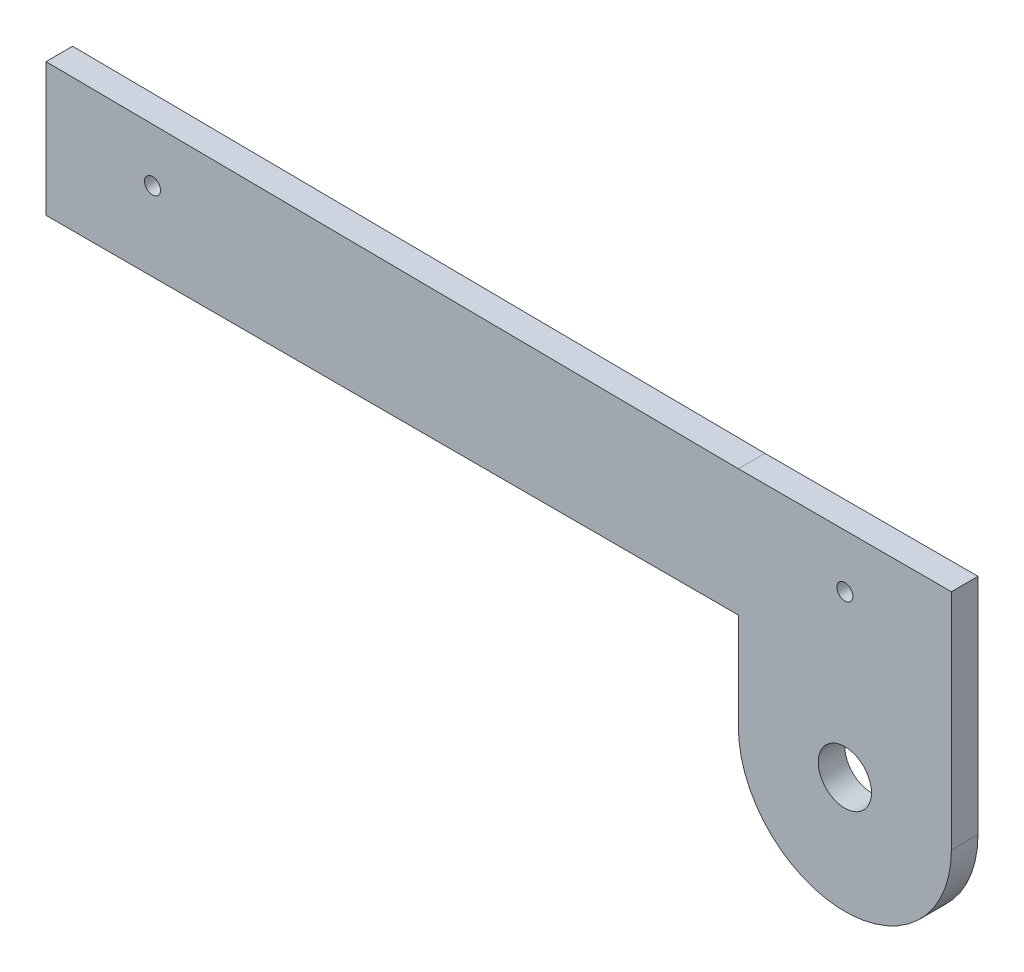
ISO-10303-21;
HEADER;
FILE_DESCRIPTION(('STEP AP214'),'2;1');
FILE_NAME('part.step','',(''),(''),'','','');
FILE_SCHEMA(('AUTOMOTIVE_DESIGN { 1 0 10303 214 1 1 1 1 }'));
ENDSEC;
DATA;
#1=APPLICATION_CONTEXT('core data for automotive mechanical design processes');
#2=APPLICATION_PROTOCOL_DEFINITION('international standard','automotive_design',2000,#1);
#3=PRODUCT_CONTEXT('',#1,'mechanical');
#4=PRODUCT('Part','Part','',(#3));
#5=PRODUCT_RELATED_PRODUCT_CATEGORY('part','',(#4));
#6=PRODUCT_DEFINITION_FORMATION('','',#4);
#7=PRODUCT_DEFINITION_CONTEXT('part definition',#1,'design');
#8=PRODUCT_DEFINITION('design','',#6,#7);
#9=PRODUCT_DEFINITION_SHAPE('','',#8);
#10=(LENGTH_UNIT() NAMED_UNIT(*) SI_UNIT(.MILLI.,.METRE.));
#11=(NAMED_UNIT(*) PLANE_ANGLE_UNIT() SI_UNIT($,.RADIAN.));
#12=(NAMED_UNIT(*) SI_UNIT($,.STERADIAN.) SOLID_ANGLE_UNIT());
#13=UNCERTAINTY_MEASURE_WITH_UNIT(LENGTH_MEASURE(1.E-05),#10,'distance_accuracy_value','');
#14=(GEOMETRIC_REPRESENTATION_CONTEXT(3) GLOBAL_UNCERTAINTY_ASSIGNED_CONTEXT((#13)) GLOBAL_UNIT_ASSIGNED_CONTEXT((#10,
#11,#12)) REPRESENTATION_CONTEXT('',''));
#15=CARTESIAN_POINT('',(0.,0.,0.));
#16=DIRECTION('',(0.,0.,1.));
#17=DIRECTION('',(1.,0.,0.));
#18=AXIS2_PLACEMENT_3D('',#15,#16,#17);
#19=CARTESIAN_POINT('',(0.,-76.7077662842641,5.));
#20=DIRECTION('',(0.,0.,1.));
#21=DIRECTION('',(1.,0.,0.));
#22=AXIS2_PLACEMENT_3D('',#19,#20,#21);
#23=PLANE('',#22);
#24=CARTESIAN_POINT('',(0.,-74.9078805598017,5.));
#25=DIRECTION('',(0.,0.,1.));
#26=DIRECTION('',(1.,0.,0.));
#27=AXIS2_PLACEMENT_3D('',#24,#25,#26);
#28=CIRCLE('',#27,5.);
#29=CARTESIAN_POINT('',(5.,-74.9078805598017,5.));
#30=VERTEX_POINT('',#29);
#31=EDGE_CURVE('E206',#30,#30,#28,.F.);
#32=ORIENTED_EDGE('',*,*,#31,.T.);
#33=EDGE_LOOP('',(#32));
#34=FACE_BOUND('',#33,.T.);
#35=CARTESIAN_POINT('',(0.,-44.7077662842641,5.));
#36=DIRECTION('',(0.,0.,1.));
#37=DIRECTION('',(1.,0.,0.));
#38=AXIS2_PLACEMENT_3D('',#35,#36,#37);
#39=CIRCLE('',#38,1.5);
#40=CARTESIAN_POINT('',(1.50000000000001,-44.7077662842641,5.));
#41=VERTEX_POINT('',#40);
#42=EDGE_CURVE('E145',#41,#41,#39,.T.);
#43=ORIENTED_EDGE('',*,*,#42,.F.);
#44=EDGE_LOOP('',(#43));
#45=FACE_BOUND('',#44,.T.);
#46=CARTESIAN_POINT('',(0.,-76.7077662842641,5.));
#47=DIRECTION('',(0.,0.,1.));
#48=DIRECTION('',(1.,0.,0.));
#49=AXIS2_PLACEMENT_3D('',#46,#47,#48);
#50=CIRCLE('',#49,20.);
#51=CARTESIAN_POINT('',(-20.,-76.7077662842641,5.));
#52=VERTEX_POINT('',#51);
#53=CARTESIAN_POINT('',(20.,-76.7077662842641,5.));
#54=VERTEX_POINT('',#53);
#55=EDGE_CURVE('E160',#52,#54,#50,.T.);
#56=ORIENTED_EDGE('',*,*,#55,.T.);
#57=DIRECTION('',(0.,1.,0.));
#58=VECTOR('',#57,1.);
#59=CARTESIAN_POINT('',(20.,-34.7077662842641,5.));
#60=LINE('',#59,#58);
#61=CARTESIAN_POINT('',(20.,-34.7077662842641,5.));
#62=VERTEX_POINT('',#61);
#63=EDGE_CURVE('E102',#54,#62,#60,.T.);
#64=ORIENTED_EDGE('',*,*,#63,.T.);
#65=DIRECTION('',(-1.,0.,0.));
#66=VECTOR('',#65,1.);
#67=CARTESIAN_POINT('',(-20.,-34.7077662842641,5.));
#68=LINE('',#67,#66);
#69=CARTESIAN_POINT('',(-20.,-34.7077662842641,5.));
#70=VERTEX_POINT('',#69);
#71=EDGE_CURVE('E178',#62,#70,#68,.T.);
#72=ORIENTED_EDGE('',*,*,#71,.T.);
#73=DIRECTION('',(-0.999957141967498,0.00925819789123466,0.));
#74=VECTOR('',#73,1.);
#75=CARTESIAN_POINT('',(-20.,-34.7077662842641,5.));
#76=LINE('',#75,#74);
#77=CARTESIAN_POINT('',(-150.,-33.5041489737338,5.));
#78=VERTEX_POINT('',#77);
#79=EDGE_CURVE('E118',#70,#78,#76,.T.);
#80=ORIENTED_EDGE('',*,*,#79,.T.);
#81=DIRECTION('',(0.,-1.,0.));
#82=VECTOR('',#81,1.);
#83=CARTESIAN_POINT('',(-150.,-33.5041489737338,5.));
#84=LINE('',#83,#82);
#85=CARTESIAN_POINT('',(-150.,-58.5041489737338,5.));
#86=VERTEX_POINT('',#85);
#87=EDGE_CURVE('E112',#78,#86,#84,.T.);
#88=ORIENTED_EDGE('',*,*,#87,.T.);
#89=DIRECTION('',(1.,0.,0.));
#90=VECTOR('',#89,1.);
#91=CARTESIAN_POINT('',(-150.,-58.5041489737338,5.));
#92=LINE('',#91,#90);
#93=CARTESIAN_POINT('',(-20.,-58.5041489737338,5.));
#94=VERTEX_POINT('',#93);
#95=EDGE_CURVE('E116',#86,#94,#92,.T.);
#96=ORIENTED_EDGE('',*,*,#95,.T.);
#97=DIRECTION('',(0.,-1.,0.));
#98=VECTOR('',#97,1.);
#99=CARTESIAN_POINT('',(-20.,-76.7077662842641,5.));
#100=LINE('',#99,#98);
#101=EDGE_CURVE('E62',#94,#52,#100,.T.);
#102=ORIENTED_EDGE('',*,*,#101,.T.);
#103=EDGE_LOOP('',(#56,#64,#72,#80,#88,#96,#102));
#104=FACE_BOUND('',#103,.T.);
#105=CARTESIAN_POINT('',(-130.,-43.6897494663554,5.));
#106=DIRECTION('',(0.,0.,1.));
#107=DIRECTION('',(1.,0.,0.));
#108=AXIS2_PLACEMENT_3D('',#105,#106,#107);
#109=CIRCLE('',#108,1.5);
#110=CARTESIAN_POINT('',(-128.5,-43.6897494663554,5.));
#111=VERTEX_POINT('',#110);
#112=EDGE_CURVE('E198',#111,#111,#109,.T.);
#113=ORIENTED_EDGE('',*,*,#112,.F.);
#114=EDGE_LOOP('',(#113));
#115=FACE_BOUND('',#114,.T.);
#116=ADVANCED_FACE('F43',(#34,#45,#104,#115),#23,.T.);
#117=CARTESIAN_POINT('',(0.,-76.7077662842641,0.));
#118=DIRECTION('',(0.,0.,1.));
#119=DIRECTION('',(1.,0.,0.));
#120=AXIS2_PLACEMENT_3D('',#117,#118,#119);
#121=PLANE('',#120);
#122=CARTESIAN_POINT('',(0.,-74.9078805598017,0.));
#123=DIRECTION('',(0.,0.,1.));
#124=DIRECTION('',(1.,0.,0.));
#125=AXIS2_PLACEMENT_3D('',#122,#123,#124);
#126=CIRCLE('',#125,5.);
#127=CARTESIAN_POINT('',(5.,-74.9078805598017,0.));
#128=VERTEX_POINT('',#127);
#129=EDGE_CURVE('E47',#128,#128,#126,.F.);
#130=ORIENTED_EDGE('',*,*,#129,.F.);
#131=EDGE_LOOP('',(#130));
#132=FACE_BOUND('',#131,.T.);
#133=CARTESIAN_POINT('',(0.,-76.7077662842641,0.));
#134=DIRECTION('',(0.,0.,1.));
#135=DIRECTION('',(1.,0.,0.));
#136=AXIS2_PLACEMENT_3D('',#133,#134,#135);
#137=CIRCLE('',#136,20.);
#138=CARTESIAN_POINT('',(-20.,-76.7077662842641,0.));
#139=VERTEX_POINT('',#138);
#140=CARTESIAN_POINT('',(20.,-76.7077662842641,0.));
#141=VERTEX_POINT('',#140);
#142=EDGE_CURVE('E140',#139,#141,#137,.T.);
#143=ORIENTED_EDGE('',*,*,#142,.F.);
#144=DIRECTION('',(0.,-1.,0.));
#145=VECTOR('',#144,1.);
#146=CARTESIAN_POINT('',(-20.,-76.7077662842641,0.));
#147=LINE('',#146,#145);
#148=CARTESIAN_POINT('',(-20.,-58.5041489737338,0.));
#149=VERTEX_POINT('',#148);
#150=EDGE_CURVE('E94',#149,#139,#147,.T.);
#151=ORIENTED_EDGE('',*,*,#150,.F.);
#152=DIRECTION('',(1.,0.,0.));
#153=VECTOR('',#152,1.);
#154=CARTESIAN_POINT('',(-150.,-58.5041489737338,0.));
#155=LINE('',#154,#153);
#156=CARTESIAN_POINT('',(-150.,-58.5041489737338,0.));
#157=VERTEX_POINT('',#156);
#158=EDGE_CURVE('E88',#157,#149,#155,.T.);
#159=ORIENTED_EDGE('',*,*,#158,.F.);
#160=DIRECTION('',(0.,-1.,0.));
#161=VECTOR('',#160,1.);
#162=CARTESIAN_POINT('',(-150.,-33.5041489737338,0.));
#163=LINE('',#162,#161);
#164=CARTESIAN_POINT('',(-150.,-33.5041489737338,0.));
#165=VERTEX_POINT('',#164);
#166=EDGE_CURVE('E127',#165,#157,#163,.T.);
#167=ORIENTED_EDGE('',*,*,#166,.F.);
#168=DIRECTION('',(-0.999957141967498,0.00925819789123466,0.));
#169=VECTOR('',#168,1.);
#170=CARTESIAN_POINT('',(-20.,-34.7077662842641,0.));
#171=LINE('',#170,#169);
#172=CARTESIAN_POINT('',(-20.,-34.7077662842641,0.));
#173=VERTEX_POINT('',#172);
#174=EDGE_CURVE('E151',#173,#165,#171,.T.);
#175=ORIENTED_EDGE('',*,*,#174,.F.);
#176=DIRECTION('',(-1.,0.,0.));
#177=VECTOR('',#176,1.);
#178=CARTESIAN_POINT('',(-20.,-34.7077662842641,0.));
#179=LINE('',#178,#177);
#180=CARTESIAN_POINT('',(20.,-34.7077662842641,0.));
#181=VERTEX_POINT('',#180);
#182=EDGE_CURVE('E148',#181,#173,#179,.T.);
#183=ORIENTED_EDGE('',*,*,#182,.F.);
#184=DIRECTION('',(0.,1.,0.));
#185=VECTOR('',#184,1.);
#186=CARTESIAN_POINT('',(20.,-34.7077662842641,0.));
#187=LINE('',#186,#185);
#188=EDGE_CURVE('E144',#141,#181,#187,.T.);
#189=ORIENTED_EDGE('',*,*,#188,.F.);
#190=EDGE_LOOP('',(#143,#151,#159,#167,#175,#183,#189));
#191=FACE_BOUND('',#190,.T.);
#192=CARTESIAN_POINT('',(0.,-44.7077662842641,0.));
#193=DIRECTION('',(0.,0.,1.));
#194=DIRECTION('',(1.,0.,0.));
#195=AXIS2_PLACEMENT_3D('',#192,#193,#194);
#196=CIRCLE('',#195,1.5);
#197=CARTESIAN_POINT('',(1.50000000000001,-44.7077662842641,0.));
#198=VERTEX_POINT('',#197);
#199=EDGE_CURVE('E194',#198,#198,#196,.T.);
#200=ORIENTED_EDGE('',*,*,#199,.T.);
#201=EDGE_LOOP('',(#200));
#202=FACE_BOUND('',#201,.T.);
#203=CARTESIAN_POINT('',(-130.,-43.6897494663554,0.));
#204=DIRECTION('',(0.,0.,1.));
#205=DIRECTION('',(1.,0.,0.));
#206=AXIS2_PLACEMENT_3D('',#203,#204,#205);
#207=CIRCLE('',#206,1.5);
#208=CARTESIAN_POINT('',(-128.5,-43.6897494663554,0.));
#209=VERTEX_POINT('',#208);
#210=EDGE_CURVE('E202',#209,#209,#207,.T.);
#211=ORIENTED_EDGE('',*,*,#210,.T.);
#212=EDGE_LOOP('',(#211));
#213=FACE_BOUND('',#212,.T.);
#214=ADVANCED_FACE('F182',(#132,#191,#202,#213),#121,.F.);
#215=CARTESIAN_POINT('',(0.,-76.7077662842641,5.));
#216=DIRECTION('',(0.,0.,-1.));
#217=DIRECTION('',(-1.,0.,0.));
#218=AXIS2_PLACEMENT_3D('',#215,#216,#217);
#219=CYLINDRICAL_SURFACE('',#218,20.);
#220=ORIENTED_EDGE('',*,*,#142,.T.);
#221=DIRECTION('',(0.,0.,-1.));
#222=VECTOR('',#221,1.);
#223=CARTESIAN_POINT('',(20.,-76.7077662842641,5.));
#224=LINE('',#223,#222);
#225=EDGE_CURVE('E11',#54,#141,#224,.T.);
#226=ORIENTED_EDGE('',*,*,#225,.F.);
#227=ORIENTED_EDGE('',*,*,#55,.F.);
#228=DIRECTION('',(0.,0.,-1.));
#229=VECTOR('',#228,1.);
#230=CARTESIAN_POINT('',(-20.,-76.7077662842641,5.));
#231=LINE('',#230,#229);
#232=EDGE_CURVE('E136',#52,#139,#231,.T.);
#233=ORIENTED_EDGE('',*,*,#232,.T.);
#234=EDGE_LOOP('',(#220,#226,#227,#233));
#235=FACE_BOUND('',#234,.T.);
#236=ADVANCED_FACE('F45',(#235),#219,.T.);
#237=CARTESIAN_POINT('',(20.,-34.7077662842641,5.));
#238=DIRECTION('',(-1.,0.,0.));
#239=DIRECTION('',(0.,-1.,0.));
#240=AXIS2_PLACEMENT_3D('',#237,#238,#239);
#241=PLANE('',#240);
#242=ORIENTED_EDGE('',*,*,#188,.T.);
#243=DIRECTION('',(0.,0.,-1.));
#244=VECTOR('',#243,1.);
#245=CARTESIAN_POINT('',(20.,-34.7077662842641,5.));
#246=LINE('',#245,#244);
#247=EDGE_CURVE('E54',#62,#181,#246,.T.);
#248=ORIENTED_EDGE('',*,*,#247,.F.);
#249=ORIENTED_EDGE('',*,*,#63,.F.);
#250=ORIENTED_EDGE('',*,*,#225,.T.);
#251=EDGE_LOOP('',(#242,#248,#249,#250));
#252=FACE_BOUND('',#251,.T.);
#253=ADVANCED_FACE('F226',(#252),#241,.F.);
#254=CARTESIAN_POINT('',(-20.,-34.7077662842641,5.));
#255=DIRECTION('',(0.,-1.,0.));
#256=DIRECTION('',(0.,0.,-1.));
#257=AXIS2_PLACEMENT_3D('',#254,#255,#256);
#258=PLANE('',#257);
#259=ORIENTED_EDGE('',*,*,#182,.T.);
#260=DIRECTION('',(0.,0.,-1.));
#261=VECTOR('',#260,1.);
#262=CARTESIAN_POINT('',(-20.,-34.7077662842641,5.));
#263=LINE('',#262,#261);
#264=EDGE_CURVE('E167',#70,#173,#263,.T.);
#265=ORIENTED_EDGE('',*,*,#264,.F.);
#266=ORIENTED_EDGE('',*,*,#71,.F.);
#267=ORIENTED_EDGE('',*,*,#247,.T.);
#268=EDGE_LOOP('',(#259,#265,#266,#267));
#269=FACE_BOUND('',#268,.T.);
#270=ADVANCED_FACE('F176',(#269),#258,.F.);
#271=CARTESIAN_POINT('',(-20.,-34.7077662842641,5.));
#272=DIRECTION('',(-0.00925819789123466,-0.999957141967498,0.));
#273=DIRECTION('',(0.999957141967498,-0.00925819789123466,0.));
#274=AXIS2_PLACEMENT_3D('',#271,#272,#273);
#275=PLANE('',#274);
#276=ORIENTED_EDGE('',*,*,#174,.T.);
#277=DIRECTION('',(0.,0.,-1.));
#278=VECTOR('',#277,1.);
#279=CARTESIAN_POINT('',(-150.,-33.5041489737338,5.));
#280=LINE('',#279,#278);
#281=EDGE_CURVE('E129',#78,#165,#280,.T.);
#282=ORIENTED_EDGE('',*,*,#281,.F.);
#283=ORIENTED_EDGE('',*,*,#79,.F.);
#284=ORIENTED_EDGE('',*,*,#264,.T.);
#285=EDGE_LOOP('',(#276,#282,#283,#284));
#286=FACE_BOUND('',#285,.T.);
#287=ADVANCED_FACE('F185',(#286),#275,.F.);
#288=CARTESIAN_POINT('',(-150.,-33.5041489737338,5.));
#289=DIRECTION('',(1.,0.,0.));
#290=DIRECTION('',(0.,0.,-1.));
#291=AXIS2_PLACEMENT_3D('',#288,#289,#290);
#292=PLANE('',#291);
#293=ORIENTED_EDGE('',*,*,#166,.T.);
#294=DIRECTION('',(0.,0.,-1.));
#295=VECTOR('',#294,1.);
#296=CARTESIAN_POINT('',(-150.,-58.5041489737338,5.));
#297=LINE('',#296,#295);
#298=EDGE_CURVE('E124',#86,#157,#297,.T.);
#299=ORIENTED_EDGE('',*,*,#298,.F.);
#300=ORIENTED_EDGE('',*,*,#87,.F.);
#301=ORIENTED_EDGE('',*,*,#281,.T.);
#302=EDGE_LOOP('',(#293,#299,#300,#301));
#303=FACE_BOUND('',#302,.T.);
#304=ADVANCED_FACE('F125',(#303),#292,.F.);
#305=CARTESIAN_POINT('',(-150.,-58.5041489737338,5.));
#306=DIRECTION('',(0.,1.,0.));
#307=DIRECTION('',(0.,0.,1.));
#308=AXIS2_PLACEMENT_3D('',#305,#306,#307);
#309=PLANE('',#308);
#310=ORIENTED_EDGE('',*,*,#158,.T.);
#311=DIRECTION('',(0.,0.,-1.));
#312=VECTOR('',#311,1.);
#313=CARTESIAN_POINT('',(-20.,-58.5041489737338,5.));
#314=LINE('',#313,#312);
#315=EDGE_CURVE('E130',#94,#149,#314,.T.);
#316=ORIENTED_EDGE('',*,*,#315,.F.);
#317=ORIENTED_EDGE('',*,*,#95,.F.);
#318=ORIENTED_EDGE('',*,*,#298,.T.);
#319=EDGE_LOOP('',(#310,#316,#317,#318));
#320=FACE_BOUND('',#319,.T.);
#321=ADVANCED_FACE('F132',(#320),#309,.F.);
#322=CARTESIAN_POINT('',(-20.,-76.7077662842641,5.));
#323=DIRECTION('',(1.,0.,0.));
#324=DIRECTION('',(0.,1.,0.));
#325=AXIS2_PLACEMENT_3D('',#322,#323,#324);
#326=PLANE('',#325);
#327=ORIENTED_EDGE('',*,*,#150,.T.);
#328=ORIENTED_EDGE('',*,*,#232,.F.);
#329=ORIENTED_EDGE('',*,*,#101,.F.);
#330=ORIENTED_EDGE('',*,*,#315,.T.);
#331=EDGE_LOOP('',(#327,#328,#329,#330));
#332=FACE_BOUND('',#331,.T.);
#333=ADVANCED_FACE('F231',(#332),#326,.F.);
#334=CARTESIAN_POINT('',(0.,-44.7077662842641,5.));
#335=DIRECTION('',(0.,0.,-1.));
#336=DIRECTION('',(-1.,0.,0.));
#337=AXIS2_PLACEMENT_3D('',#334,#335,#336);
#338=CYLINDRICAL_SURFACE('',#337,1.5);
#339=ORIENTED_EDGE('',*,*,#42,.T.);
#340=EDGE_LOOP('',(#339));
#341=FACE_BOUND('',#340,.T.);
#342=ORIENTED_EDGE('',*,*,#199,.F.);
#343=EDGE_LOOP('',(#342));
#344=FACE_BOUND('',#343,.T.);
#345=ADVANCED_FACE('F234',(#341,#344),#338,.F.);
#346=CARTESIAN_POINT('',(-130.,-43.6897494663554,5.));
#347=DIRECTION('',(0.,0.,-1.));
#348=DIRECTION('',(-1.,0.,0.));
#349=AXIS2_PLACEMENT_3D('',#346,#347,#348);
#350=CYLINDRICAL_SURFACE('',#349,1.5);
#351=ORIENTED_EDGE('',*,*,#112,.T.);
#352=EDGE_LOOP('',(#351));
#353=FACE_BOUND('',#352,.T.);
#354=ORIENTED_EDGE('',*,*,#210,.F.);
#355=EDGE_LOOP('',(#354));
#356=FACE_BOUND('',#355,.T.);
#357=ADVANCED_FACE('F275',(#353,#356),#350,.F.);
#358=CARTESIAN_POINT('',(0.,-74.9078805598017,42.));
#359=DIRECTION('',(0.,0.,-1.));
#360=DIRECTION('',(-1.,0.,0.));
#361=AXIS2_PLACEMENT_3D('',#358,#359,#360);
#362=CYLINDRICAL_SURFACE('',#361,5.);
#363=ORIENTED_EDGE('',*,*,#31,.F.);
#364=EDGE_LOOP('',(#363));
#365=FACE_BOUND('',#364,.T.);
#366=ORIENTED_EDGE('',*,*,#129,.T.);
#367=EDGE_LOOP('',(#366));
#368=FACE_BOUND('',#367,.T.);
#369=ADVANCED_FACE('F218',(#365,#368),#362,.F.);
#370=CLOSED_SHELL('',(#116,#214,#236,#253,#270,#287,#304,#321,#333,#345,#357,#369));
#371=MANIFOLD_SOLID_BREP('B2',#370);
#372=ADVANCED_BREP_SHAPE_REPRESENTATION('',(#18,#371),#14);
#373=SHAPE_DEFINITION_REPRESENTATION(#9,#372);
ENDSEC;
END-ISO-10303-21;
